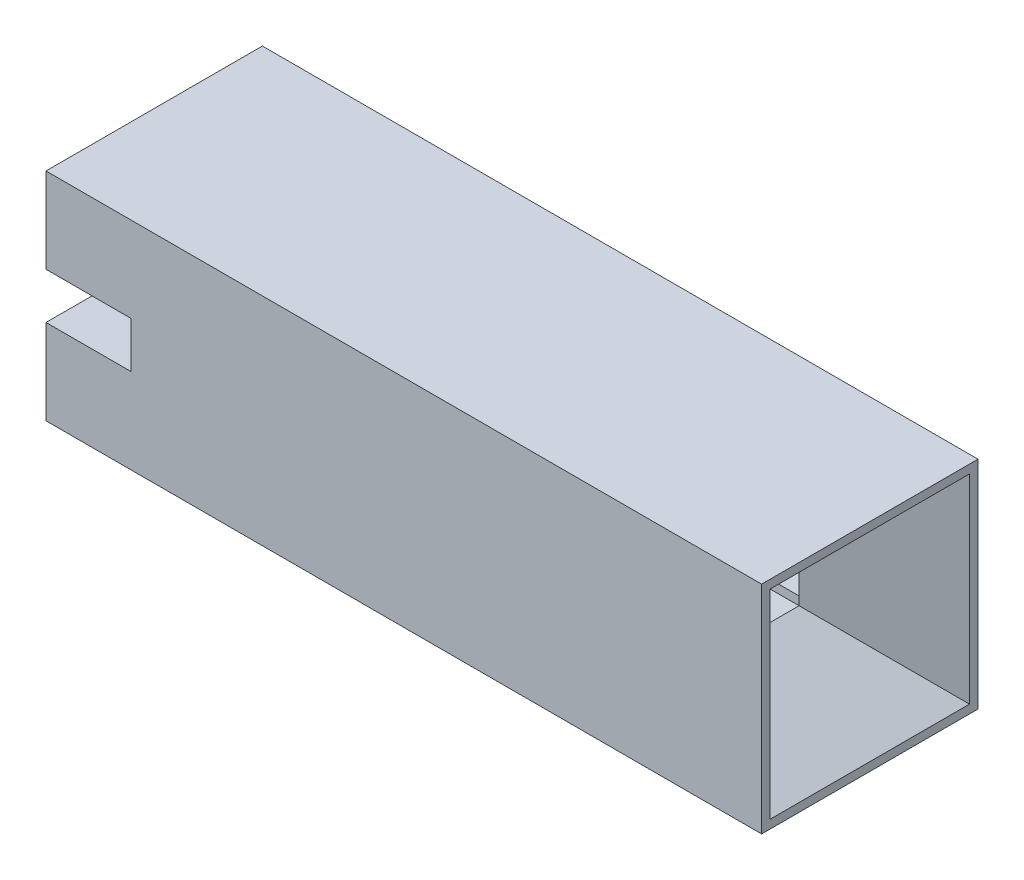
ISO-10303-21;
HEADER;
FILE_DESCRIPTION(('STEP AP214'),'2;1');
FILE_NAME('part.step','',(''),(''),'','','');
FILE_SCHEMA(('AUTOMOTIVE_DESIGN { 1 0 10303 214 1 1 1 1 }'));
ENDSEC;
DATA;
#1=APPLICATION_CONTEXT('core data for automotive mechanical design processes');
#2=APPLICATION_PROTOCOL_DEFINITION('international standard','automotive_design',2000,#1);
#3=PRODUCT_CONTEXT('',#1,'mechanical');
#4=PRODUCT('Part','Part','',(#3));
#5=PRODUCT_RELATED_PRODUCT_CATEGORY('part','',(#4));
#6=PRODUCT_DEFINITION_FORMATION('','',#4);
#7=PRODUCT_DEFINITION_CONTEXT('part definition',#1,'design');
#8=PRODUCT_DEFINITION('design','',#6,#7);
#9=PRODUCT_DEFINITION_SHAPE('','',#8);
#10=(LENGTH_UNIT() NAMED_UNIT(*) SI_UNIT(.MILLI.,.METRE.));
#11=(NAMED_UNIT(*) PLANE_ANGLE_UNIT() SI_UNIT($,.RADIAN.));
#12=(NAMED_UNIT(*) SI_UNIT($,.STERADIAN.) SOLID_ANGLE_UNIT());
#13=UNCERTAINTY_MEASURE_WITH_UNIT(LENGTH_MEASURE(1.E-05),#10,'distance_accuracy_value','');
#14=(GEOMETRIC_REPRESENTATION_CONTEXT(3) GLOBAL_UNCERTAINTY_ASSIGNED_CONTEXT((#13)) GLOBAL_UNIT_ASSIGNED_CONTEXT((#10,
#11,#12)) REPRESENTATION_CONTEXT('',''));
#15=CARTESIAN_POINT('',(0.,0.,0.));
#16=DIRECTION('',(0.,0.,1.));
#17=DIRECTION('',(1.,0.,0.));
#18=AXIS2_PLACEMENT_3D('',#15,#16,#17);
#19=CARTESIAN_POINT('',(-0.000999999999999265,1.64,1.64));
#20=DIRECTION('',(0.,0.,1.));
#21=DIRECTION('',(1.,0.,0.));
#22=AXIS2_PLACEMENT_3D('',#19,#20,#21);
#23=PLANE('',#22);
#24=DIRECTION('',(1.,0.,0.));
#25=VECTOR('',#24,1.);
#26=CARTESIAN_POINT('',(-0.000999999999999265,1.,1.64));
#27=LINE('',#26,#25);
#28=CARTESIAN_POINT('',(0.,1.,1.64));
#29=VERTEX_POINT('',#28);
#30=CARTESIAN_POINT('',(7.2,1.,1.64));
#31=VERTEX_POINT('',#30);
#32=EDGE_CURVE('E273',#29,#31,#27,.T.);
#33=ORIENTED_EDGE('',*,*,#32,.T.);
#34=DIRECTION('',(0.,-1.,0.));
#35=VECTOR('',#34,1.);
#36=CARTESIAN_POINT('',(7.2,1.64000000000001,1.64));
#37=LINE('',#36,#35);
#38=CARTESIAN_POINT('',(7.20000000000001,0.9,1.64));
#39=VERTEX_POINT('',#38);
#40=EDGE_CURVE('E364',#31,#39,#37,.T.);
#41=ORIENTED_EDGE('',*,*,#40,.T.);
#42=DIRECTION('',(1.,0.,0.));
#43=VECTOR('',#42,1.);
#44=CARTESIAN_POINT('',(-0.000999999999999265,0.9,1.64));
#45=LINE('',#44,#43);
#46=CARTESIAN_POINT('',(0.,0.9,1.64));
#47=VERTEX_POINT('',#46);
#48=EDGE_CURVE('E301',#47,#39,#45,.T.);
#49=ORIENTED_EDGE('',*,*,#48,.F.);
#50=DIRECTION('',(0.,1.,0.));
#51=VECTOR('',#50,1.);
#52=CARTESIAN_POINT('',(0.,1.64,1.64));
#53=LINE('',#52,#51);
#54=EDGE_CURVE('E297',#47,#29,#53,.T.);
#55=ORIENTED_EDGE('',*,*,#54,.T.);
#56=EDGE_LOOP('',(#33,#41,#49,#55));
#57=FACE_BOUND('',#56,.T.);
#58=ADVANCED_FACE('F40',(#57),#23,.F.);
#59=CARTESIAN_POINT('',(-0.000999999999999265,1.64,0.9));
#60=DIRECTION('',(0.,0.,-1.));
#61=DIRECTION('',(0.,1.,0.));
#62=AXIS2_PLACEMENT_3D('',#59,#60,#61);
#63=PLANE('',#62);
#64=DIRECTION('',(0.,1.,0.));
#65=VECTOR('',#64,1.);
#66=CARTESIAN_POINT('',(7.2,1.64000000000001,0.9));
#67=LINE('',#66,#65);
#68=CARTESIAN_POINT('',(7.2,0.900000000000011,0.9));
#69=VERTEX_POINT('',#68);
#70=CARTESIAN_POINT('',(7.2,1.,0.900000000000001));
#71=VERTEX_POINT('',#70);
#72=EDGE_CURVE('E386',#69,#71,#67,.T.);
#73=ORIENTED_EDGE('',*,*,#72,.T.);
#74=DIRECTION('',(-1.,0.,0.));
#75=VECTOR('',#74,1.);
#76=CARTESIAN_POINT('',(-0.000999999999999265,1.,0.9));
#77=LINE('',#76,#75);
#78=CARTESIAN_POINT('',(0.,1.,0.9));
#79=VERTEX_POINT('',#78);
#80=EDGE_CURVE('E49',#71,#79,#77,.T.);
#81=ORIENTED_EDGE('',*,*,#80,.T.);
#82=DIRECTION('',(0.,-1.,0.));
#83=VECTOR('',#82,1.);
#84=CARTESIAN_POINT('',(0.,1.64,0.9));
#85=LINE('',#84,#83);
#86=CARTESIAN_POINT('',(0.,0.900000000000011,0.9));
#87=VERTEX_POINT('',#86);
#88=EDGE_CURVE('E292',#79,#87,#85,.T.);
#89=ORIENTED_EDGE('',*,*,#88,.T.);
#90=DIRECTION('',(1.,0.,0.));
#91=VECTOR('',#90,1.);
#92=CARTESIAN_POINT('',(-0.000999999999999265,0.900000000000011,0.9));
#93=LINE('',#92,#91);
#94=EDGE_CURVE('E310',#87,#69,#93,.T.);
#95=ORIENTED_EDGE('',*,*,#94,.T.);
#96=EDGE_LOOP('',(#73,#81,#89,#95));
#97=FACE_BOUND('',#96,.T.);
#98=ADVANCED_FACE('F410',(#97),#63,.F.);
#99=CARTESIAN_POINT('',(0.,0.,2.54));
#100=DIRECTION('',(1.,0.,0.));
#101=DIRECTION('',(0.,0.,-1.));
#102=AXIS2_PLACEMENT_3D('',#99,#100,#101);
#103=PLANE('',#102);
#104=DIRECTION('',(0.,-1.,0.));
#105=VECTOR('',#104,1.);
#106=CARTESIAN_POINT('',(0.,0.,0.));
#107=LINE('',#106,#105);
#108=CARTESIAN_POINT('',(0.,2.54,0.));
#109=VERTEX_POINT('',#108);
#110=CARTESIAN_POINT('',(0.,1.54,0.));
#111=VERTEX_POINT('',#110);
#112=EDGE_CURVE('E336',#109,#111,#107,.T.);
#113=ORIENTED_EDGE('',*,*,#112,.T.);
#114=DIRECTION('',(0.,0.,-1.));
#115=VECTOR('',#114,1.);
#116=CARTESIAN_POINT('',(0.,1.54,0.));
#117=LINE('',#116,#115);
#118=CARTESIAN_POINT('',(0.,1.54,0.9));
#119=VERTEX_POINT('',#118);
#120=EDGE_CURVE('E266',#119,#111,#117,.T.);
#121=ORIENTED_EDGE('',*,*,#120,.F.);
#122=CARTESIAN_POINT('',(0.,1.64,0.9));
#123=VERTEX_POINT('',#122);
#124=EDGE_CURVE('E287',#123,#119,#85,.T.);
#125=ORIENTED_EDGE('',*,*,#124,.F.);
#126=DIRECTION('',(0.,0.,-1.));
#127=VECTOR('',#126,1.);
#128=CARTESIAN_POINT('',(0.,1.64,1.64));
#129=LINE('',#128,#127);
#130=CARTESIAN_POINT('',(0.,1.64,1.64));
#131=VERTEX_POINT('',#130);
#132=EDGE_CURVE('E291',#131,#123,#129,.T.);
#133=ORIENTED_EDGE('',*,*,#132,.F.);
#134=CARTESIAN_POINT('',(0.,1.54,1.64));
#135=VERTEX_POINT('',#134);
#136=EDGE_CURVE('E296',#135,#131,#53,.T.);
#137=ORIENTED_EDGE('',*,*,#136,.F.);
#138=CARTESIAN_POINT('',(0.,1.54,2.54));
#139=VERTEX_POINT('',#138);
#140=EDGE_CURVE('E250',#139,#135,#117,.T.);
#141=ORIENTED_EDGE('',*,*,#140,.F.);
#142=DIRECTION('',(0.,-1.,0.));
#143=VECTOR('',#142,1.);
#144=CARTESIAN_POINT('',(0.,0.,2.54));
#145=LINE('',#144,#143);
#146=CARTESIAN_POINT('',(0.,2.54,2.54));
#147=VERTEX_POINT('',#146);
#148=EDGE_CURVE('E321',#147,#139,#145,.T.);
#149=ORIENTED_EDGE('',*,*,#148,.F.);
#150=DIRECTION('',(0.,0.,-1.));
#151=VECTOR('',#150,1.);
#152=CARTESIAN_POINT('',(0.,2.54,2.54));
#153=LINE('',#152,#151);
#154=EDGE_CURVE('E335',#147,#109,#153,.T.);
#155=ORIENTED_EDGE('',*,*,#154,.T.);
#156=EDGE_LOOP('',(#113,#121,#125,#133,#137,#141,#149,#155));
#157=FACE_BOUND('',#156,.T.);
#158=ADVANCED_FACE('F499',(#157),#103,.F.);
#159=CARTESIAN_POINT('',(0.,1.,2.54));
#160=VERTEX_POINT('',#159);
#161=CARTESIAN_POINT('',(0.,0.,2.54));
#162=VERTEX_POINT('',#161);
#163=EDGE_CURVE('E326',#160,#162,#145,.T.);
#164=ORIENTED_EDGE('',*,*,#163,.F.);
#165=DIRECTION('',(0.,0.,1.));
#166=VECTOR('',#165,1.);
#167=CARTESIAN_POINT('',(0.,1.,0.));
#168=LINE('',#167,#166);
#169=EDGE_CURVE('E244',#29,#160,#168,.T.);
#170=ORIENTED_EDGE('',*,*,#169,.F.);
#171=ORIENTED_EDGE('',*,*,#54,.F.);
#172=DIRECTION('',(0.,0.,1.));
#173=VECTOR('',#172,1.);
#174=CARTESIAN_POINT('',(0.,0.9,1.64));
#175=LINE('',#174,#173);
#176=EDGE_CURVE('E306',#87,#47,#175,.T.);
#177=ORIENTED_EDGE('',*,*,#176,.F.);
#178=ORIENTED_EDGE('',*,*,#88,.F.);
#179=CARTESIAN_POINT('',(0.,1.,0.));
#180=VERTEX_POINT('',#179);
#181=EDGE_CURVE('E263',#180,#79,#168,.T.);
#182=ORIENTED_EDGE('',*,*,#181,.F.);
#183=CARTESIAN_POINT('',(0.,0.,0.));
#184=VERTEX_POINT('',#183);
#185=EDGE_CURVE('E320',#180,#184,#107,.T.);
#186=ORIENTED_EDGE('',*,*,#185,.T.);
#187=DIRECTION('',(0.,0.,-1.));
#188=VECTOR('',#187,1.);
#189=CARTESIAN_POINT('',(0.,0.,2.54));
#190=LINE('',#189,#188);
#191=EDGE_CURVE('E360',#162,#184,#190,.T.);
#192=ORIENTED_EDGE('',*,*,#191,.F.);
#193=EDGE_LOOP('',(#164,#170,#171,#177,#178,#182,#186,#192));
#194=FACE_BOUND('',#193,.T.);
#195=ADVANCED_FACE('F419',(#194),#103,.F.);
#196=CARTESIAN_POINT('',(0.,0.,2.54));
#197=DIRECTION('',(0.,1.,0.));
#198=DIRECTION('',(0.,0.,1.));
#199=AXIS2_PLACEMENT_3D('',#196,#197,#198);
#200=PLANE('',#199);
#201=DIRECTION('',(1.,0.,0.));
#202=VECTOR('',#201,1.);
#203=CARTESIAN_POINT('',(0.,0.,0.));
#204=LINE('',#203,#202);
#205=CARTESIAN_POINT('',(8.4,0.,0.));
#206=VERTEX_POINT('',#205);
#207=EDGE_CURVE('E340',#184,#206,#204,.T.);
#208=ORIENTED_EDGE('',*,*,#207,.T.);
#209=DIRECTION('',(0.,0.,-1.));
#210=VECTOR('',#209,1.);
#211=CARTESIAN_POINT('',(8.4,0.,2.54));
#212=LINE('',#211,#210);
#213=CARTESIAN_POINT('',(8.4,0.,2.54));
#214=VERTEX_POINT('',#213);
#215=EDGE_CURVE('E356',#214,#206,#212,.T.);
#216=ORIENTED_EDGE('',*,*,#215,.F.);
#217=DIRECTION('',(1.,0.,0.));
#218=VECTOR('',#217,1.);
#219=CARTESIAN_POINT('',(0.,0.,2.54));
#220=LINE('',#219,#218);
#221=EDGE_CURVE('E325',#162,#214,#220,.T.);
#222=ORIENTED_EDGE('',*,*,#221,.F.);
#223=ORIENTED_EDGE('',*,*,#191,.T.);
#224=EDGE_LOOP('',(#208,#216,#222,#223));
#225=FACE_BOUND('',#224,.T.);
#226=ADVANCED_FACE('F486',(#225),#200,.F.);
#227=CARTESIAN_POINT('',(8.4,0.,2.54));
#228=DIRECTION('',(-1.,0.,0.));
#229=DIRECTION('',(0.,-1.,0.));
#230=AXIS2_PLACEMENT_3D('',#227,#228,#229);
#231=PLANE('',#230);
#232=DIRECTION('',(0.,0.,1.));
#233=VECTOR('',#232,1.);
#234=CARTESIAN_POINT('',(8.4,0.09999999999999,2.54));
#235=LINE('',#234,#233);
#236=CARTESIAN_POINT('',(8.4,0.100000000000028,0.100000000000002));
#237=VERTEX_POINT('',#236);
#238=CARTESIAN_POINT('',(8.4,0.0999999999999915,2.44));
#239=VERTEX_POINT('',#238);
#240=EDGE_CURVE('E376',#237,#239,#235,.T.);
#241=ORIENTED_EDGE('',*,*,#240,.T.);
#242=DIRECTION('',(0.,1.,0.));
#243=VECTOR('',#242,1.);
#244=CARTESIAN_POINT('',(8.4,0.,2.44));
#245=LINE('',#244,#243);
#246=CARTESIAN_POINT('',(8.4,2.44,2.44));
#247=VERTEX_POINT('',#246);
#248=EDGE_CURVE('E379',#239,#247,#245,.T.);
#249=ORIENTED_EDGE('',*,*,#248,.T.);
#250=DIRECTION('',(0.,0.,-1.));
#251=VECTOR('',#250,1.);
#252=CARTESIAN_POINT('',(8.4,2.44,2.54));
#253=LINE('',#252,#251);
#254=CARTESIAN_POINT('',(8.4,2.44,0.100000000000002));
#255=VERTEX_POINT('',#254);
#256=EDGE_CURVE('E369',#247,#255,#253,.T.);
#257=ORIENTED_EDGE('',*,*,#256,.T.);
#258=DIRECTION('',(0.,-1.,0.));
#259=VECTOR('',#258,1.);
#260=CARTESIAN_POINT('',(8.4,0.,0.100000000000002));
#261=LINE('',#260,#259);
#262=EDGE_CURVE('E373',#255,#237,#261,.T.);
#263=ORIENTED_EDGE('',*,*,#262,.T.);
#264=EDGE_LOOP('',(#241,#249,#257,#263));
#265=FACE_BOUND('',#264,.T.);
#266=DIRECTION('',(0.,1.,0.));
#267=VECTOR('',#266,1.);
#268=CARTESIAN_POINT('',(8.4,0.,0.));
#269=LINE('',#268,#267);
#270=CARTESIAN_POINT('',(8.4,2.54,0.));
#271=VERTEX_POINT('',#270);
#272=EDGE_CURVE('E343',#206,#271,#269,.T.);
#273=ORIENTED_EDGE('',*,*,#272,.T.);
#274=DIRECTION('',(0.,0.,-1.));
#275=VECTOR('',#274,1.);
#276=CARTESIAN_POINT('',(8.4,2.54,2.54));
#277=LINE('',#276,#275);
#278=CARTESIAN_POINT('',(8.4,2.54,2.54));
#279=VERTEX_POINT('',#278);
#280=EDGE_CURVE('E352',#279,#271,#277,.T.);
#281=ORIENTED_EDGE('',*,*,#280,.F.);
#282=DIRECTION('',(0.,1.,0.));
#283=VECTOR('',#282,1.);
#284=CARTESIAN_POINT('',(8.4,0.,2.54));
#285=LINE('',#284,#283);
#286=EDGE_CURVE('E329',#214,#279,#285,.T.);
#287=ORIENTED_EDGE('',*,*,#286,.F.);
#288=ORIENTED_EDGE('',*,*,#215,.T.);
#289=EDGE_LOOP('',(#273,#281,#287,#288));
#290=FACE_BOUND('',#289,.T.);
#291=ADVANCED_FACE('F493',(#265,#290),#231,.F.);
#292=CARTESIAN_POINT('',(0.,2.54,2.54));
#293=DIRECTION('',(0.,-1.,0.));
#294=DIRECTION('',(0.,0.,-1.));
#295=AXIS2_PLACEMENT_3D('',#292,#293,#294);
#296=PLANE('',#295);
#297=DIRECTION('',(-1.,0.,0.));
#298=VECTOR('',#297,1.);
#299=CARTESIAN_POINT('',(0.,2.54,0.));
#300=LINE('',#299,#298);
#301=EDGE_CURVE('E346',#271,#109,#300,.T.);
#302=ORIENTED_EDGE('',*,*,#301,.T.);
#303=ORIENTED_EDGE('',*,*,#154,.F.);
#304=DIRECTION('',(-1.,0.,0.));
#305=VECTOR('',#304,1.);
#306=CARTESIAN_POINT('',(0.,2.54,2.54));
#307=LINE('',#306,#305);
#308=EDGE_CURVE('E332',#279,#147,#307,.T.);
#309=ORIENTED_EDGE('',*,*,#308,.F.);
#310=ORIENTED_EDGE('',*,*,#280,.T.);
#311=EDGE_LOOP('',(#302,#303,#309,#310));
#312=FACE_BOUND('',#311,.T.);
#313=ADVANCED_FACE('F497',(#312),#296,.F.);
#314=CARTESIAN_POINT('',(0.,0.,2.54));
#315=DIRECTION('',(0.,0.,-1.));
#316=DIRECTION('',(-1.,0.,0.));
#317=AXIS2_PLACEMENT_3D('',#314,#315,#316);
#318=PLANE('',#317);
#319=ORIENTED_EDGE('',*,*,#148,.T.);
#320=DIRECTION('',(-1.,0.,0.));
#321=VECTOR('',#320,1.);
#322=CARTESIAN_POINT('',(1.,1.54,2.54));
#323=LINE('',#322,#321);
#324=CARTESIAN_POINT('',(1.,1.54,2.54));
#325=VERTEX_POINT('',#324);
#326=EDGE_CURVE('E274',#325,#139,#323,.T.);
#327=ORIENTED_EDGE('',*,*,#326,.F.);
#328=DIRECTION('',(0.,1.,0.));
#329=VECTOR('',#328,1.);
#330=CARTESIAN_POINT('',(1.,1.54,2.54));
#331=LINE('',#330,#329);
#332=CARTESIAN_POINT('',(1.,1.,2.54));
#333=VERTEX_POINT('',#332);
#334=EDGE_CURVE('E255',#333,#325,#331,.T.);
#335=ORIENTED_EDGE('',*,*,#334,.F.);
#336=DIRECTION('',(-1.,0.,0.));
#337=VECTOR('',#336,1.);
#338=CARTESIAN_POINT('',(1.,1.,2.54));
#339=LINE('',#338,#337);
#340=EDGE_CURVE('E277',#333,#160,#339,.T.);
#341=ORIENTED_EDGE('',*,*,#340,.T.);
#342=ORIENTED_EDGE('',*,*,#163,.T.);
#343=ORIENTED_EDGE('',*,*,#221,.T.);
#344=ORIENTED_EDGE('',*,*,#286,.T.);
#345=ORIENTED_EDGE('',*,*,#308,.T.);
#346=EDGE_LOOP('',(#319,#327,#335,#341,#342,#343,#344,#345));
#347=FACE_BOUND('',#346,.T.);
#348=ADVANCED_FACE('F480',(#347),#318,.F.);
#349=CARTESIAN_POINT('',(0.,0.,0.));
#350=DIRECTION('',(0.,0.,-1.));
#351=DIRECTION('',(-1.,0.,0.));
#352=AXIS2_PLACEMENT_3D('',#349,#350,#351);
#353=PLANE('',#352);
#354=DIRECTION('',(-1.,0.,0.));
#355=VECTOR('',#354,1.);
#356=CARTESIAN_POINT('',(1.,1.54,0.));
#357=LINE('',#356,#355);
#358=CARTESIAN_POINT('',(1.,1.54,0.));
#359=VERTEX_POINT('',#358);
#360=EDGE_CURVE('E269',#359,#111,#357,.T.);
#361=ORIENTED_EDGE('',*,*,#360,.T.);
#362=ORIENTED_EDGE('',*,*,#112,.F.);
#363=ORIENTED_EDGE('',*,*,#301,.F.);
#364=ORIENTED_EDGE('',*,*,#272,.F.);
#365=ORIENTED_EDGE('',*,*,#207,.F.);
#366=ORIENTED_EDGE('',*,*,#185,.F.);
#367=DIRECTION('',(-1.,0.,0.));
#368=VECTOR('',#367,1.);
#369=CARTESIAN_POINT('',(1.,1.,0.));
#370=LINE('',#369,#368);
#371=CARTESIAN_POINT('',(1.,1.,0.));
#372=VERTEX_POINT('',#371);
#373=EDGE_CURVE('E262',#372,#180,#370,.T.);
#374=ORIENTED_EDGE('',*,*,#373,.F.);
#375=DIRECTION('',(0.,-1.,0.));
#376=VECTOR('',#375,1.);
#377=CARTESIAN_POINT('',(1.,1.54,0.));
#378=LINE('',#377,#376);
#379=EDGE_CURVE('E245',#359,#372,#378,.T.);
#380=ORIENTED_EDGE('',*,*,#379,.F.);
#381=EDGE_LOOP('',(#361,#362,#363,#364,#365,#366,#374,#380));
#382=FACE_BOUND('',#381,.T.);
#383=ADVANCED_FACE('F442',(#382),#353,.T.);
#384=CARTESIAN_POINT('',(7.2,1.64,1.64));
#385=VERTEX_POINT('',#384);
#386=CARTESIAN_POINT('',(7.2,1.54,1.64));
#387=VERTEX_POINT('',#386);
#388=EDGE_CURVE('E365',#385,#387,#37,.T.);
#389=ORIENTED_EDGE('',*,*,#388,.T.);
#390=DIRECTION('',(-1.,0.,0.));
#391=VECTOR('',#390,1.);
#392=CARTESIAN_POINT('',(-0.000999999999999265,1.54,1.64));
#393=LINE('',#392,#391);
#394=EDGE_CURVE('E203',#387,#135,#393,.T.);
#395=ORIENTED_EDGE('',*,*,#394,.T.);
#396=ORIENTED_EDGE('',*,*,#136,.T.);
#397=DIRECTION('',(1.,0.,0.));
#398=VECTOR('',#397,1.);
#399=CARTESIAN_POINT('',(-0.000999999999999265,1.64,1.64));
#400=LINE('',#399,#398);
#401=EDGE_CURVE('E302',#131,#385,#400,.T.);
#402=ORIENTED_EDGE('',*,*,#401,.T.);
#403=EDGE_LOOP('',(#389,#395,#396,#402));
#404=FACE_BOUND('',#403,.T.);
#405=ADVANCED_FACE('F466',(#404),#23,.F.);
#406=CARTESIAN_POINT('',(-0.000999999999999265,1.64,1.64));
#407=DIRECTION('',(0.,1.,0.));
#408=DIRECTION('',(0.,0.,1.));
#409=AXIS2_PLACEMENT_3D('',#406,#407,#408);
#410=PLANE('',#409);
#411=DIRECTION('',(1.,0.,0.));
#412=VECTOR('',#411,1.);
#413=CARTESIAN_POINT('',(-0.000999999999999265,1.64,0.9));
#414=LINE('',#413,#412);
#415=CARTESIAN_POINT('',(7.2,1.64,0.9));
#416=VERTEX_POINT('',#415);
#417=EDGE_CURVE('E307',#123,#416,#414,.T.);
#418=ORIENTED_EDGE('',*,*,#417,.T.);
#419=DIRECTION('',(0.,0.,1.));
#420=VECTOR('',#419,1.);
#421=CARTESIAN_POINT('',(7.2,1.64,1.64));
#422=LINE('',#421,#420);
#423=EDGE_CURVE('E390',#416,#385,#422,.T.);
#424=ORIENTED_EDGE('',*,*,#423,.T.);
#425=ORIENTED_EDGE('',*,*,#401,.F.);
#426=ORIENTED_EDGE('',*,*,#132,.T.);
#427=EDGE_LOOP('',(#418,#424,#425,#426));
#428=FACE_BOUND('',#427,.T.);
#429=ADVANCED_FACE('F463',(#428),#410,.F.);
#430=DIRECTION('',(1.,0.,0.));
#431=VECTOR('',#430,1.);
#432=CARTESIAN_POINT('',(-0.000999999999999265,1.54,0.9));
#433=LINE('',#432,#431);
#434=CARTESIAN_POINT('',(7.2,1.54,0.900000000000001));
#435=VERTEX_POINT('',#434);
#436=EDGE_CURVE('E11',#119,#435,#433,.T.);
#437=ORIENTED_EDGE('',*,*,#436,.T.);
#438=EDGE_CURVE('E63',#435,#416,#67,.T.);
#439=ORIENTED_EDGE('',*,*,#438,.T.);
#440=ORIENTED_EDGE('',*,*,#417,.F.);
#441=ORIENTED_EDGE('',*,*,#124,.T.);
#442=EDGE_LOOP('',(#437,#439,#440,#441));
#443=FACE_BOUND('',#442,.T.);
#444=ADVANCED_FACE('F530',(#443),#63,.F.);
#445=CARTESIAN_POINT('',(-0.000999999999999265,0.9,1.64));
#446=DIRECTION('',(0.,-1.,0.));
#447=DIRECTION('',(0.,0.,-1.));
#448=AXIS2_PLACEMENT_3D('',#445,#446,#447);
#449=PLANE('',#448);
#450=ORIENTED_EDGE('',*,*,#48,.T.);
#451=DIRECTION('',(0.,0.,-1.));
#452=VECTOR('',#451,1.);
#453=CARTESIAN_POINT('',(7.20000000000001,0.9,1.64));
#454=LINE('',#453,#452);
#455=EDGE_CURVE('E383',#39,#69,#454,.T.);
#456=ORIENTED_EDGE('',*,*,#455,.T.);
#457=ORIENTED_EDGE('',*,*,#94,.F.);
#458=ORIENTED_EDGE('',*,*,#176,.T.);
#459=EDGE_LOOP('',(#450,#456,#457,#458));
#460=FACE_BOUND('',#459,.T.);
#461=ADVANCED_FACE('F511',(#460),#449,.F.);
#462=CARTESIAN_POINT('',(7.2,1.64000000000001,0.9));
#463=DIRECTION('',(-0.554700196225228,0.,-0.832050294337844));
#464=DIRECTION('',(0.,1.,0.));
#465=AXIS2_PLACEMENT_3D('',#462,#463,#464);
#466=PLANE('',#465);
#467=DIRECTION('',(0.727606875109003,-0.485071250072659,-0.485071250072667));
#468=VECTOR('',#467,1.);
#469=CARTESIAN_POINT('',(6.93882352941177,1.07411764705883,1.07411764705882));
#470=LINE('',#469,#468);
#471=EDGE_CURVE('E399',#237,#69,#470,.F.);
#472=ORIENTED_EDGE('',*,*,#471,.F.);
#473=ORIENTED_EDGE('',*,*,#262,.F.);
#474=DIRECTION('',(0.727606875108999,0.485071250072666,-0.485071250072665));
#475=VECTOR('',#474,1.);
#476=CARTESIAN_POINT('',(7.20000000000001,1.64,0.899999999999998));
#477=LINE('',#476,#475);
#478=EDGE_CURVE('E403',#416,#255,#477,.T.);
#479=ORIENTED_EDGE('',*,*,#478,.F.);
#480=ORIENTED_EDGE('',*,*,#438,.F.);
#481=DIRECTION('',(0.,1.,0.));
#482=VECTOR('',#481,1.);
#483=CARTESIAN_POINT('',(7.2,1.64000000000001,0.900000000000001));
#484=LINE('',#483,#482);
#485=EDGE_CURVE('E235',#435,#71,#484,.F.);
#486=ORIENTED_EDGE('',*,*,#485,.T.);
#487=ORIENTED_EDGE('',*,*,#72,.F.);
#488=EDGE_LOOP('',(#472,#473,#479,#480,#486,#487));
#489=FACE_BOUND('',#488,.T.);
#490=ADVANCED_FACE('F42',(#489),#466,.F.);
#491=CARTESIAN_POINT('',(7.2,1.64,1.64));
#492=DIRECTION('',(-0.554700196225229,0.832050294337844,0.));
#493=DIRECTION('',(0.,0.,1.));
#494=AXIS2_PLACEMENT_3D('',#491,#492,#493);
#495=PLANE('',#494);
#496=ORIENTED_EDGE('',*,*,#478,.T.);
#497=ORIENTED_EDGE('',*,*,#256,.F.);
#498=DIRECTION('',(-0.727606875108999,-0.485071250072666,-0.485071250072665));
#499=VECTOR('',#498,1.);
#500=CARTESIAN_POINT('',(7.20000000000001,1.64,1.64));
#501=LINE('',#500,#499);
#502=EDGE_CURVE('E396',#385,#247,#501,.F.);
#503=ORIENTED_EDGE('',*,*,#502,.F.);
#504=ORIENTED_EDGE('',*,*,#423,.F.);
#505=EDGE_LOOP('',(#496,#497,#503,#504));
#506=FACE_BOUND('',#505,.T.);
#507=ADVANCED_FACE('F459',(#506),#495,.F.);
#508=CARTESIAN_POINT('',(7.20000000000001,0.9,1.64));
#509=DIRECTION('',(-0.554700196225228,-0.832050294337845,0.));
#510=DIRECTION('',(0.,0.,-1.));
#511=AXIS2_PLACEMENT_3D('',#508,#509,#510);
#512=PLANE('',#511);
#513=ORIENTED_EDGE('',*,*,#471,.T.);
#514=ORIENTED_EDGE('',*,*,#455,.F.);
#515=DIRECTION('',(0.727606875108998,-0.485071250072671,0.485071250072663));
#516=VECTOR('',#515,1.);
#517=CARTESIAN_POINT('',(6.93882352941176,1.07411764705883,1.46588235294117));
#518=LINE('',#517,#516);
#519=EDGE_CURVE('E286',#239,#39,#518,.F.);
#520=ORIENTED_EDGE('',*,*,#519,.F.);
#521=ORIENTED_EDGE('',*,*,#240,.F.);
#522=EDGE_LOOP('',(#513,#514,#520,#521));
#523=FACE_BOUND('',#522,.T.);
#524=ADVANCED_FACE('F514',(#523),#512,.F.);
#525=CARTESIAN_POINT('',(7.2,1.64000000000001,1.64));
#526=DIRECTION('',(-0.554700196225228,0.,0.832050294337844));
#527=DIRECTION('',(0.,-1.,0.));
#528=AXIS2_PLACEMENT_3D('',#525,#526,#527);
#529=PLANE('',#528);
#530=ORIENTED_EDGE('',*,*,#502,.T.);
#531=ORIENTED_EDGE('',*,*,#248,.F.);
#532=ORIENTED_EDGE('',*,*,#519,.T.);
#533=ORIENTED_EDGE('',*,*,#40,.F.);
#534=EDGE_CURVE('E370',#387,#31,#37,.T.);
#535=ORIENTED_EDGE('',*,*,#534,.F.);
#536=ORIENTED_EDGE('',*,*,#388,.F.);
#537=EDGE_LOOP('',(#530,#531,#532,#533,#535,#536));
#538=FACE_BOUND('',#537,.T.);
#539=ADVANCED_FACE('F505',(#538),#529,.F.);
#540=CARTESIAN_POINT('',(1.,0.,0.));
#541=DIRECTION('',(-1.,0.,0.));
#542=DIRECTION('',(0.,0.,1.));
#543=AXIS2_PLACEMENT_3D('',#540,#541,#542);
#544=PLANE('',#543);
#545=DIRECTION('',(0.,-1.,0.));
#546=VECTOR('',#545,1.);
#547=CARTESIAN_POINT('',(1.,1.,0.4));
#548=LINE('',#547,#546);
#549=CARTESIAN_POINT('',(1.,1.54,0.4));
#550=VERTEX_POINT('',#549);
#551=CARTESIAN_POINT('',(1.,1.,0.4));
#552=VERTEX_POINT('',#551);
#553=EDGE_CURVE('E216',#550,#552,#548,.T.);
#554=ORIENTED_EDGE('',*,*,#553,.F.);
#555=DIRECTION('',(0.,0.,-1.));
#556=VECTOR('',#555,1.);
#557=CARTESIAN_POINT('',(1.,1.54,0.));
#558=LINE('',#557,#556);
#559=EDGE_CURVE('E258',#550,#359,#558,.T.);
#560=ORIENTED_EDGE('',*,*,#559,.T.);
#561=ORIENTED_EDGE('',*,*,#379,.T.);
#562=DIRECTION('',(0.,0.,1.));
#563=VECTOR('',#562,1.);
#564=CARTESIAN_POINT('',(1.,1.,0.));
#565=LINE('',#564,#563);
#566=EDGE_CURVE('E251',#372,#552,#565,.T.);
#567=ORIENTED_EDGE('',*,*,#566,.T.);
#568=EDGE_LOOP('',(#554,#560,#561,#567));
#569=FACE_BOUND('',#568,.T.);
#570=ADVANCED_FACE('F433',(#569),#544,.T.);
#571=CARTESIAN_POINT('',(1.,1.,0.));
#572=DIRECTION('',(0.,-1.,0.));
#573=DIRECTION('',(0.,0.,-1.));
#574=AXIS2_PLACEMENT_3D('',#571,#572,#573);
#575=PLANE('',#574);
#576=ORIENTED_EDGE('',*,*,#566,.F.);
#577=ORIENTED_EDGE('',*,*,#373,.T.);
#578=ORIENTED_EDGE('',*,*,#181,.T.);
#579=ORIENTED_EDGE('',*,*,#80,.F.);
#580=DIRECTION('',(0.,0.,1.));
#581=VECTOR('',#580,1.);
#582=CARTESIAN_POINT('',(7.2,1.,2.14));
#583=LINE('',#582,#581);
#584=CARTESIAN_POINT('',(7.2,1.,0.4));
#585=VERTEX_POINT('',#584);
#586=EDGE_CURVE('E197',#585,#71,#583,.T.);
#587=ORIENTED_EDGE('',*,*,#586,.F.);
#588=DIRECTION('',(-1.,0.,0.));
#589=VECTOR('',#588,1.);
#590=CARTESIAN_POINT('',(7.2,1.,0.4));
#591=LINE('',#590,#589);
#592=EDGE_CURVE('E236',#585,#552,#591,.T.);
#593=ORIENTED_EDGE('',*,*,#592,.T.);
#594=EDGE_LOOP('',(#576,#577,#578,#579,#587,#593));
#595=FACE_BOUND('',#594,.T.);
#596=ADVANCED_FACE('F444',(#595),#575,.F.);
#597=CARTESIAN_POINT('',(1.,1.54,0.));
#598=DIRECTION('',(0.,1.,0.));
#599=DIRECTION('',(0.,0.,1.));
#600=AXIS2_PLACEMENT_3D('',#597,#598,#599);
#601=PLANE('',#600);
#602=ORIENTED_EDGE('',*,*,#120,.T.);
#603=ORIENTED_EDGE('',*,*,#360,.F.);
#604=ORIENTED_EDGE('',*,*,#559,.F.);
#605=DIRECTION('',(-1.,0.,0.));
#606=VECTOR('',#605,1.);
#607=CARTESIAN_POINT('',(7.2,1.54,0.4));
#608=LINE('',#607,#606);
#609=CARTESIAN_POINT('',(7.2,1.54,0.4));
#610=VERTEX_POINT('',#609);
#611=EDGE_CURVE('E196',#610,#550,#608,.T.);
#612=ORIENTED_EDGE('',*,*,#611,.F.);
#613=DIRECTION('',(0.,0.,-1.));
#614=VECTOR('',#613,1.);
#615=CARTESIAN_POINT('',(7.2,1.54,2.14));
#616=LINE('',#615,#614);
#617=EDGE_CURVE('E209',#435,#610,#616,.T.);
#618=ORIENTED_EDGE('',*,*,#617,.F.);
#619=ORIENTED_EDGE('',*,*,#436,.F.);
#620=EDGE_LOOP('',(#602,#603,#604,#612,#618,#619));
#621=FACE_BOUND('',#620,.T.);
#622=ADVANCED_FACE('F438',(#621),#601,.F.);
#623=CARTESIAN_POINT('',(1.,1.54,2.14));
#624=VERTEX_POINT('',#623);
#625=EDGE_CURVE('E259',#325,#624,#558,.T.);
#626=ORIENTED_EDGE('',*,*,#625,.F.);
#627=ORIENTED_EDGE('',*,*,#326,.T.);
#628=ORIENTED_EDGE('',*,*,#140,.T.);
#629=ORIENTED_EDGE('',*,*,#394,.F.);
#630=CARTESIAN_POINT('',(7.2,1.54,2.14));
#631=VERTEX_POINT('',#630);
#632=EDGE_CURVE('E200',#631,#387,#616,.T.);
#633=ORIENTED_EDGE('',*,*,#632,.F.);
#634=DIRECTION('',(-1.,0.,0.));
#635=VECTOR('',#634,1.);
#636=CARTESIAN_POINT('',(7.2,1.54,2.14));
#637=LINE('',#636,#635);
#638=EDGE_CURVE('E187',#631,#624,#637,.T.);
#639=ORIENTED_EDGE('',*,*,#638,.T.);
#640=EDGE_LOOP('',(#626,#627,#628,#629,#633,#639));
#641=FACE_BOUND('',#640,.T.);
#642=ADVANCED_FACE('F201',(#641),#601,.F.);
#643=ORIENTED_EDGE('',*,*,#169,.T.);
#644=ORIENTED_EDGE('',*,*,#340,.F.);
#645=CARTESIAN_POINT('',(1.,1.,2.14));
#646=VERTEX_POINT('',#645);
#647=EDGE_CURVE('E249',#646,#333,#565,.T.);
#648=ORIENTED_EDGE('',*,*,#647,.F.);
#649=DIRECTION('',(-1.,0.,0.));
#650=VECTOR('',#649,1.);
#651=CARTESIAN_POINT('',(7.2,1.,2.14));
#652=LINE('',#651,#650);
#653=CARTESIAN_POINT('',(7.2,1.,2.14));
#654=VERTEX_POINT('',#653);
#655=EDGE_CURVE('E232',#654,#646,#652,.T.);
#656=ORIENTED_EDGE('',*,*,#655,.F.);
#657=EDGE_CURVE('E213',#31,#654,#583,.T.);
#658=ORIENTED_EDGE('',*,*,#657,.F.);
#659=ORIENTED_EDGE('',*,*,#32,.F.);
#660=EDGE_LOOP('',(#643,#644,#648,#656,#658,#659));
#661=FACE_BOUND('',#660,.T.);
#662=ADVANCED_FACE('F476',(#661),#575,.F.);
#663=DIRECTION('',(0.,1.,0.));
#664=VECTOR('',#663,1.);
#665=CARTESIAN_POINT('',(1.,1.,2.14));
#666=LINE('',#665,#664);
#667=EDGE_CURVE('E56',#646,#624,#666,.T.);
#668=ORIENTED_EDGE('',*,*,#667,.F.);
#669=ORIENTED_EDGE('',*,*,#647,.T.);
#670=ORIENTED_EDGE('',*,*,#334,.T.);
#671=ORIENTED_EDGE('',*,*,#625,.T.);
#672=EDGE_LOOP('',(#668,#669,#670,#671));
#673=FACE_BOUND('',#672,.T.);
#674=ADVANCED_FACE('F501',(#673),#544,.T.);
#675=CARTESIAN_POINT('',(7.2,1.,2.14));
#676=DIRECTION('',(0.,0.,1.));
#677=DIRECTION('',(1.,0.,0.));
#678=AXIS2_PLACEMENT_3D('',#675,#676,#677);
#679=PLANE('',#678);
#680=ORIENTED_EDGE('',*,*,#667,.T.);
#681=ORIENTED_EDGE('',*,*,#638,.F.);
#682=DIRECTION('',(0.,1.,0.));
#683=VECTOR('',#682,1.);
#684=CARTESIAN_POINT('',(7.2,1.,2.14));
#685=LINE('',#684,#683);
#686=EDGE_CURVE('E191',#654,#631,#685,.T.);
#687=ORIENTED_EDGE('',*,*,#686,.F.);
#688=ORIENTED_EDGE('',*,*,#655,.T.);
#689=EDGE_LOOP('',(#680,#681,#687,#688));
#690=FACE_BOUND('',#689,.T.);
#691=ADVANCED_FACE('F189',(#690),#679,.F.);
#692=CARTESIAN_POINT('',(7.2,0.,0.));
#693=DIRECTION('',(-1.,0.,0.));
#694=DIRECTION('',(0.,0.,1.));
#695=AXIS2_PLACEMENT_3D('',#692,#693,#694);
#696=PLANE('',#695);
#697=ORIENTED_EDGE('',*,*,#657,.T.);
#698=ORIENTED_EDGE('',*,*,#686,.T.);
#699=ORIENTED_EDGE('',*,*,#632,.T.);
#700=ORIENTED_EDGE('',*,*,#534,.T.);
#701=EDGE_LOOP('',(#697,#698,#699,#700));
#702=FACE_BOUND('',#701,.T.);
#703=ADVANCED_FACE('F211',(#702),#696,.T.);
#704=ORIENTED_EDGE('',*,*,#617,.T.);
#705=DIRECTION('',(0.,-1.,0.));
#706=VECTOR('',#705,1.);
#707=CARTESIAN_POINT('',(7.2,1.,0.4));
#708=LINE('',#707,#706);
#709=EDGE_CURVE('E208',#610,#585,#708,.T.);
#710=ORIENTED_EDGE('',*,*,#709,.T.);
#711=ORIENTED_EDGE('',*,*,#586,.T.);
#712=ORIENTED_EDGE('',*,*,#485,.F.);
#713=EDGE_LOOP('',(#704,#710,#711,#712));
#714=FACE_BOUND('',#713,.T.);
#715=ADVANCED_FACE('F701',(#714),#696,.T.);
#716=CARTESIAN_POINT('',(7.2,1.,0.4));
#717=DIRECTION('',(0.,0.,-1.));
#718=DIRECTION('',(-1.,0.,0.));
#719=AXIS2_PLACEMENT_3D('',#716,#717,#718);
#720=PLANE('',#719);
#721=ORIENTED_EDGE('',*,*,#553,.T.);
#722=ORIENTED_EDGE('',*,*,#592,.F.);
#723=ORIENTED_EDGE('',*,*,#709,.F.);
#724=ORIENTED_EDGE('',*,*,#611,.T.);
#725=EDGE_LOOP('',(#721,#722,#723,#724));
#726=FACE_BOUND('',#725,.T.);
#727=ADVANCED_FACE('F447',(#726),#720,.F.);
#728=CLOSED_SHELL('',(#58,#98,#158,#195,#226,#291,#313,#348,#383,#405,#429,#444,#461,#490,#507,
#524,#539,#570,#596,#622,#642,#662,#674,#691,#703,#715,#727));
#729=MANIFOLD_SOLID_BREP('B2',#728);
#730=ADVANCED_BREP_SHAPE_REPRESENTATION('',(#18,#729),#14);
#731=SHAPE_DEFINITION_REPRESENTATION(#9,#730);
ENDSEC;
END-ISO-10303-21;
